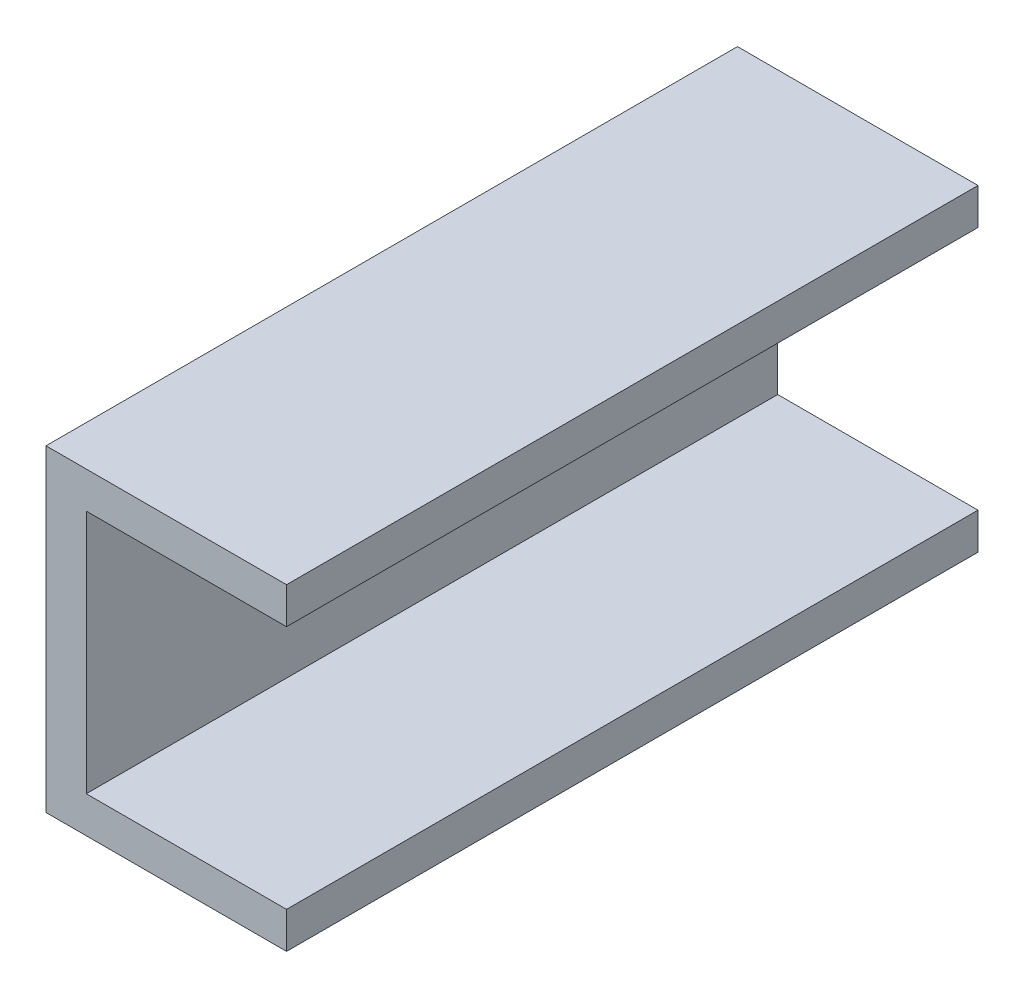
ISO-10303-21;
HEADER;
FILE_DESCRIPTION(('STEP AP214'),'2;1');
FILE_NAME('part.step','',(''),(''),'','','');
FILE_SCHEMA(('AUTOMOTIVE_DESIGN { 1 0 10303 214 1 1 1 1 }'));
ENDSEC;
DATA;
#1=APPLICATION_CONTEXT('core data for automotive mechanical design processes');
#2=APPLICATION_PROTOCOL_DEFINITION('international standard','automotive_design',2000,#1);
#3=PRODUCT_CONTEXT('',#1,'mechanical');
#4=PRODUCT('Part','Part','',(#3));
#5=PRODUCT_RELATED_PRODUCT_CATEGORY('part','',(#4));
#6=PRODUCT_DEFINITION_FORMATION('','',#4);
#7=PRODUCT_DEFINITION_CONTEXT('part definition',#1,'design');
#8=PRODUCT_DEFINITION('design','',#6,#7);
#9=PRODUCT_DEFINITION_SHAPE('','',#8);
#10=(LENGTH_UNIT() NAMED_UNIT(*) SI_UNIT(.MILLI.,.METRE.));
#11=(NAMED_UNIT(*) PLANE_ANGLE_UNIT() SI_UNIT($,.RADIAN.));
#12=(NAMED_UNIT(*) SI_UNIT($,.STERADIAN.) SOLID_ANGLE_UNIT());
#13=UNCERTAINTY_MEASURE_WITH_UNIT(LENGTH_MEASURE(1.E-05),#10,'distance_accuracy_value','');
#14=(GEOMETRIC_REPRESENTATION_CONTEXT(3) GLOBAL_UNCERTAINTY_ASSIGNED_CONTEXT((#13)) GLOBAL_UNIT_ASSIGNED_CONTEXT((#10,
#11,#12)) REPRESENTATION_CONTEXT('',''));
#15=CARTESIAN_POINT('',(0.,0.,0.));
#16=DIRECTION('',(0.,0.,1.));
#17=DIRECTION('',(1.,0.,0.));
#18=AXIS2_PLACEMENT_3D('',#15,#16,#17);
#19=CARTESIAN_POINT('',(53.0171572846732,35.,152.4));
#20=DIRECTION('',(0.,-1.,0.));
#21=DIRECTION('',(1.,0.,0.));
#22=AXIS2_PLACEMENT_3D('',#19,#20,#21);
#23=PLANE('',#22);
#24=DIRECTION('',(-1.,0.,0.));
#25=VECTOR('',#24,1.);
#26=CARTESIAN_POINT('',(53.0171572846732,35.,0.));
#27=LINE('',#26,#25);
#28=CARTESIAN_POINT('',(53.0171572846732,35.,0.));
#29=VERTEX_POINT('',#28);
#30=CARTESIAN_POINT('',(0.,35.,0.));
#31=VERTEX_POINT('',#30);
#32=EDGE_CURVE('E129',#29,#31,#27,.T.);
#33=ORIENTED_EDGE('',*,*,#32,.T.);
#34=DIRECTION('',(0.,0.,-1.));
#35=VECTOR('',#34,1.);
#36=CARTESIAN_POINT('',(0.,35.,152.4));
#37=LINE('',#36,#35);
#38=CARTESIAN_POINT('',(0.,35.,152.4));
#39=VERTEX_POINT('',#38);
#40=EDGE_CURVE('E11',#39,#31,#37,.T.);
#41=ORIENTED_EDGE('',*,*,#40,.F.);
#42=DIRECTION('',(-1.,0.,0.));
#43=VECTOR('',#42,1.);
#44=CARTESIAN_POINT('',(53.0171572846732,35.,152.4));
#45=LINE('',#44,#43);
#46=CARTESIAN_POINT('',(53.0171572846732,35.,152.4));
#47=VERTEX_POINT('',#46);
#48=EDGE_CURVE('E143',#47,#39,#45,.T.);
#49=ORIENTED_EDGE('',*,*,#48,.F.);
#50=DIRECTION('',(0.,0.,-1.));
#51=VECTOR('',#50,1.);
#52=CARTESIAN_POINT('',(53.0171572846732,35.,152.4));
#53=LINE('',#52,#51);
#54=EDGE_CURVE('E125',#47,#29,#53,.T.);
#55=ORIENTED_EDGE('',*,*,#54,.T.);
#56=EDGE_LOOP('',(#33,#41,#49,#55));
#57=FACE_BOUND('',#56,.T.);
#58=ADVANCED_FACE('F33',(#57),#23,.F.);
#59=CARTESIAN_POINT('',(0.,35.,152.4));
#60=DIRECTION('',(1.,0.,0.));
#61=DIRECTION('',(0.,1.,0.));
#62=AXIS2_PLACEMENT_3D('',#59,#60,#61);
#63=PLANE('',#62);
#64=DIRECTION('',(0.,-1.,0.));
#65=VECTOR('',#64,1.);
#66=CARTESIAN_POINT('',(0.,35.,0.));
#67=LINE('',#66,#65);
#68=CARTESIAN_POINT('',(0.,-35.,0.));
#69=VERTEX_POINT('',#68);
#70=EDGE_CURVE('E132',#31,#69,#67,.T.);
#71=ORIENTED_EDGE('',*,*,#70,.T.);
#72=DIRECTION('',(0.,0.,-1.));
#73=VECTOR('',#72,1.);
#74=CARTESIAN_POINT('',(0.,-35.,152.4));
#75=LINE('',#74,#73);
#76=CARTESIAN_POINT('',(0.,-35.,152.4));
#77=VERTEX_POINT('',#76);
#78=EDGE_CURVE('E41',#77,#69,#75,.T.);
#79=ORIENTED_EDGE('',*,*,#78,.F.);
#80=DIRECTION('',(0.,-1.,0.));
#81=VECTOR('',#80,1.);
#82=CARTESIAN_POINT('',(0.,35.,152.4));
#83=LINE('',#82,#81);
#84=EDGE_CURVE('E92',#39,#77,#83,.T.);
#85=ORIENTED_EDGE('',*,*,#84,.F.);
#86=ORIENTED_EDGE('',*,*,#40,.T.);
#87=EDGE_LOOP('',(#71,#79,#85,#86));
#88=FACE_BOUND('',#87,.T.);
#89=ADVANCED_FACE('F178',(#88),#63,.F.);
#90=CARTESIAN_POINT('',(0.,-35.,152.4));
#91=DIRECTION('',(0.,1.,0.));
#92=DIRECTION('',(0.,0.,1.));
#93=AXIS2_PLACEMENT_3D('',#90,#91,#92);
#94=PLANE('',#93);
#95=DIRECTION('',(1.,0.,0.));
#96=VECTOR('',#95,1.);
#97=CARTESIAN_POINT('',(0.,-35.,0.));
#98=LINE('',#97,#96);
#99=CARTESIAN_POINT('',(53.0171572846732,-35.,0.));
#100=VERTEX_POINT('',#99);
#101=EDGE_CURVE('E134',#69,#100,#98,.T.);
#102=ORIENTED_EDGE('',*,*,#101,.T.);
#103=DIRECTION('',(0.,0.,-1.));
#104=VECTOR('',#103,1.);
#105=CARTESIAN_POINT('',(53.0171572846732,-35.,152.4));
#106=LINE('',#105,#104);
#107=CARTESIAN_POINT('',(53.0171572846732,-35.,152.4));
#108=VERTEX_POINT('',#107);
#109=EDGE_CURVE('E150',#108,#100,#106,.T.);
#110=ORIENTED_EDGE('',*,*,#109,.F.);
#111=DIRECTION('',(1.,0.,0.));
#112=VECTOR('',#111,1.);
#113=CARTESIAN_POINT('',(0.,-35.,152.4));
#114=LINE('',#113,#112);
#115=EDGE_CURVE('E158',#77,#108,#114,.T.);
#116=ORIENTED_EDGE('',*,*,#115,.F.);
#117=ORIENTED_EDGE('',*,*,#78,.T.);
#118=EDGE_LOOP('',(#102,#110,#116,#117));
#119=FACE_BOUND('',#118,.T.);
#120=ADVANCED_FACE('F156',(#119),#94,.F.);
#121=CARTESIAN_POINT('',(53.0171572846732,-35.,152.4));
#122=DIRECTION('',(-1.,0.,0.));
#123=DIRECTION('',(0.,0.,1.));
#124=AXIS2_PLACEMENT_3D('',#121,#122,#123);
#125=PLANE('',#124);
#126=DIRECTION('',(0.,1.,0.));
#127=VECTOR('',#126,1.);
#128=CARTESIAN_POINT('',(53.0171572846732,-35.,0.));
#129=LINE('',#128,#127);
#130=CARTESIAN_POINT('',(53.0171572846732,-26.9745222929937,0.));
#131=VERTEX_POINT('',#130);
#132=EDGE_CURVE('E136',#100,#131,#129,.T.);
#133=ORIENTED_EDGE('',*,*,#132,.T.);
#134=DIRECTION('',(0.,0.,-1.));
#135=VECTOR('',#134,1.);
#136=CARTESIAN_POINT('',(53.0171572846732,-26.9745222929937,152.4));
#137=LINE('',#136,#135);
#138=CARTESIAN_POINT('',(53.0171572846732,-26.9745222929937,152.4));
#139=VERTEX_POINT('',#138);
#140=EDGE_CURVE('E147',#139,#131,#137,.T.);
#141=ORIENTED_EDGE('',*,*,#140,.F.);
#142=DIRECTION('',(0.,1.,0.));
#143=VECTOR('',#142,1.);
#144=CARTESIAN_POINT('',(53.0171572846732,-35.,152.4));
#145=LINE('',#144,#143);
#146=EDGE_CURVE('E170',#108,#139,#145,.T.);
#147=ORIENTED_EDGE('',*,*,#146,.F.);
#148=ORIENTED_EDGE('',*,*,#109,.T.);
#149=EDGE_LOOP('',(#133,#141,#147,#148));
#150=FACE_BOUND('',#149,.T.);
#151=ADVANCED_FACE('F166',(#150),#125,.F.);
#152=CARTESIAN_POINT('',(53.0171572846732,-26.9745222929937,152.4));
#153=DIRECTION('',(0.,-1.,0.));
#154=DIRECTION('',(0.,0.,-1.));
#155=AXIS2_PLACEMENT_3D('',#152,#153,#154);
#156=PLANE('',#155);
#157=DIRECTION('',(-1.,0.,0.));
#158=VECTOR('',#157,1.);
#159=CARTESIAN_POINT('',(53.0171572846732,-26.9745222929937,0.));
#160=LINE('',#159,#158);
#161=CARTESIAN_POINT('',(8.87702989613813,-26.9745222929937,0.));
#162=VERTEX_POINT('',#161);
#163=EDGE_CURVE('E138',#131,#162,#160,.T.);
#164=ORIENTED_EDGE('',*,*,#163,.T.);
#165=DIRECTION('',(0.,0.,-1.));
#166=VECTOR('',#165,1.);
#167=CARTESIAN_POINT('',(8.87702989613813,-26.9745222929937,152.4));
#168=LINE('',#167,#166);
#169=CARTESIAN_POINT('',(8.87702989613813,-26.9745222929937,152.4));
#170=VERTEX_POINT('',#169);
#171=EDGE_CURVE('E120',#170,#162,#168,.T.);
#172=ORIENTED_EDGE('',*,*,#171,.F.);
#173=DIRECTION('',(-1.,0.,0.));
#174=VECTOR('',#173,1.);
#175=CARTESIAN_POINT('',(53.0171572846732,-26.9745222929937,152.4));
#176=LINE('',#175,#174);
#177=EDGE_CURVE('E111',#139,#170,#176,.T.);
#178=ORIENTED_EDGE('',*,*,#177,.F.);
#179=ORIENTED_EDGE('',*,*,#140,.T.);
#180=EDGE_LOOP('',(#164,#172,#178,#179));
#181=FACE_BOUND('',#180,.T.);
#182=ADVANCED_FACE('F169',(#181),#156,.F.);
#183=CARTESIAN_POINT('',(8.87702989613813,-26.9745222929937,152.4));
#184=DIRECTION('',(-1.,0.,0.));
#185=DIRECTION('',(0.,0.,1.));
#186=AXIS2_PLACEMENT_3D('',#183,#184,#185);
#187=PLANE('',#186);
#188=DIRECTION('',(0.,1.,0.));
#189=VECTOR('',#188,1.);
#190=CARTESIAN_POINT('',(8.87702989613813,-26.9745222929937,0.));
#191=LINE('',#190,#189);
#192=CARTESIAN_POINT('',(8.87702989613813,26.9745222929937,0.));
#193=VERTEX_POINT('',#192);
#194=EDGE_CURVE('E119',#162,#193,#191,.T.);
#195=ORIENTED_EDGE('',*,*,#194,.T.);
#196=DIRECTION('',(0.,0.,-1.));
#197=VECTOR('',#196,1.);
#198=CARTESIAN_POINT('',(8.87702989613813,26.9745222929937,152.4));
#199=LINE('',#198,#197);
#200=CARTESIAN_POINT('',(8.87702989613813,26.9745222929937,152.4));
#201=VERTEX_POINT('',#200);
#202=EDGE_CURVE('E116',#201,#193,#199,.T.);
#203=ORIENTED_EDGE('',*,*,#202,.F.);
#204=DIRECTION('',(0.,1.,0.));
#205=VECTOR('',#204,1.);
#206=CARTESIAN_POINT('',(8.87702989613813,-26.9745222929937,152.4));
#207=LINE('',#206,#205);
#208=EDGE_CURVE('E105',#170,#201,#207,.T.);
#209=ORIENTED_EDGE('',*,*,#208,.F.);
#210=ORIENTED_EDGE('',*,*,#171,.T.);
#211=EDGE_LOOP('',(#195,#203,#209,#210));
#212=FACE_BOUND('',#211,.T.);
#213=ADVANCED_FACE('F117',(#212),#187,.F.);
#214=CARTESIAN_POINT('',(8.87702989613813,26.9745222929937,152.4));
#215=DIRECTION('',(0.,1.,0.));
#216=DIRECTION('',(0.,0.,1.));
#217=AXIS2_PLACEMENT_3D('',#214,#215,#216);
#218=PLANE('',#217);
#219=DIRECTION('',(1.,0.,0.));
#220=VECTOR('',#219,1.);
#221=CARTESIAN_POINT('',(8.87702989613813,26.9745222929937,0.));
#222=LINE('',#221,#220);
#223=CARTESIAN_POINT('',(53.0171572846732,26.9745222929937,0.));
#224=VERTEX_POINT('',#223);
#225=EDGE_CURVE('E78',#193,#224,#222,.T.);
#226=ORIENTED_EDGE('',*,*,#225,.T.);
#227=DIRECTION('',(0.,0.,-1.));
#228=VECTOR('',#227,1.);
#229=CARTESIAN_POINT('',(53.0171572846732,26.9745222929937,152.4));
#230=LINE('',#229,#228);
#231=CARTESIAN_POINT('',(53.0171572846732,26.9745222929937,152.4));
#232=VERTEX_POINT('',#231);
#233=EDGE_CURVE('E121',#232,#224,#230,.T.);
#234=ORIENTED_EDGE('',*,*,#233,.F.);
#235=DIRECTION('',(1.,0.,0.));
#236=VECTOR('',#235,1.);
#237=CARTESIAN_POINT('',(8.87702989613813,26.9745222929937,152.4));
#238=LINE('',#237,#236);
#239=EDGE_CURVE('E109',#201,#232,#238,.T.);
#240=ORIENTED_EDGE('',*,*,#239,.F.);
#241=ORIENTED_EDGE('',*,*,#202,.T.);
#242=EDGE_LOOP('',(#226,#234,#240,#241));
#243=FACE_BOUND('',#242,.T.);
#244=ADVANCED_FACE('F123',(#243),#218,.F.);
#245=CARTESIAN_POINT('',(53.0171572846732,26.9745222929937,152.4));
#246=DIRECTION('',(-1.,0.,0.));
#247=DIRECTION('',(0.,0.,1.));
#248=AXIS2_PLACEMENT_3D('',#245,#246,#247);
#249=PLANE('',#248);
#250=DIRECTION('',(0.,1.,0.));
#251=VECTOR('',#250,1.);
#252=CARTESIAN_POINT('',(53.0171572846732,26.9745222929937,0.));
#253=LINE('',#252,#251);
#254=EDGE_CURVE('E84',#224,#29,#253,.T.);
#255=ORIENTED_EDGE('',*,*,#254,.T.);
#256=ORIENTED_EDGE('',*,*,#54,.F.);
#257=DIRECTION('',(0.,1.,0.));
#258=VECTOR('',#257,1.);
#259=CARTESIAN_POINT('',(53.0171572846732,26.9745222929937,152.4));
#260=LINE('',#259,#258);
#261=EDGE_CURVE('E49',#232,#47,#260,.T.);
#262=ORIENTED_EDGE('',*,*,#261,.F.);
#263=ORIENTED_EDGE('',*,*,#233,.T.);
#264=EDGE_LOOP('',(#255,#256,#262,#263));
#265=FACE_BOUND('',#264,.T.);
#266=ADVANCED_FACE('F194',(#265),#249,.F.);
#267=CARTESIAN_POINT('',(0.,0.,152.4));
#268=DIRECTION('',(0.,0.,1.));
#269=DIRECTION('',(1.,0.,0.));
#270=AXIS2_PLACEMENT_3D('',#267,#268,#269);
#271=PLANE('',#270);
#272=ORIENTED_EDGE('',*,*,#48,.T.);
#273=ORIENTED_EDGE('',*,*,#84,.T.);
#274=ORIENTED_EDGE('',*,*,#115,.T.);
#275=ORIENTED_EDGE('',*,*,#146,.T.);
#276=ORIENTED_EDGE('',*,*,#177,.T.);
#277=ORIENTED_EDGE('',*,*,#208,.T.);
#278=ORIENTED_EDGE('',*,*,#239,.T.);
#279=ORIENTED_EDGE('',*,*,#261,.T.);
#280=EDGE_LOOP('',(#272,#273,#274,#275,#276,#277,#278,#279));
#281=FACE_BOUND('',#280,.T.);
#282=ADVANCED_FACE('F107',(#281),#271,.T.);
#283=CARTESIAN_POINT('',(0.,0.,0.));
#284=DIRECTION('',(0.,0.,1.));
#285=DIRECTION('',(1.,0.,0.));
#286=AXIS2_PLACEMENT_3D('',#283,#284,#285);
#287=PLANE('',#286);
#288=ORIENTED_EDGE('',*,*,#32,.F.);
#289=ORIENTED_EDGE('',*,*,#254,.F.);
#290=ORIENTED_EDGE('',*,*,#225,.F.);
#291=ORIENTED_EDGE('',*,*,#194,.F.);
#292=ORIENTED_EDGE('',*,*,#163,.F.);
#293=ORIENTED_EDGE('',*,*,#132,.F.);
#294=ORIENTED_EDGE('',*,*,#101,.F.);
#295=ORIENTED_EDGE('',*,*,#70,.F.);
#296=EDGE_LOOP('',(#288,#289,#290,#291,#292,#293,#294,#295));
#297=FACE_BOUND('',#296,.T.);
#298=ADVANCED_FACE('F162',(#297),#287,.F.);
#299=CLOSED_SHELL('',(#58,#89,#120,#151,#182,#213,#244,#266,#282,#298));
#300=MANIFOLD_SOLID_BREP('B2',#299);
#301=ADVANCED_BREP_SHAPE_REPRESENTATION('',(#18,#300),#14);
#302=SHAPE_DEFINITION_REPRESENTATION(#9,#301);
ENDSEC;
END-ISO-10303-21;
